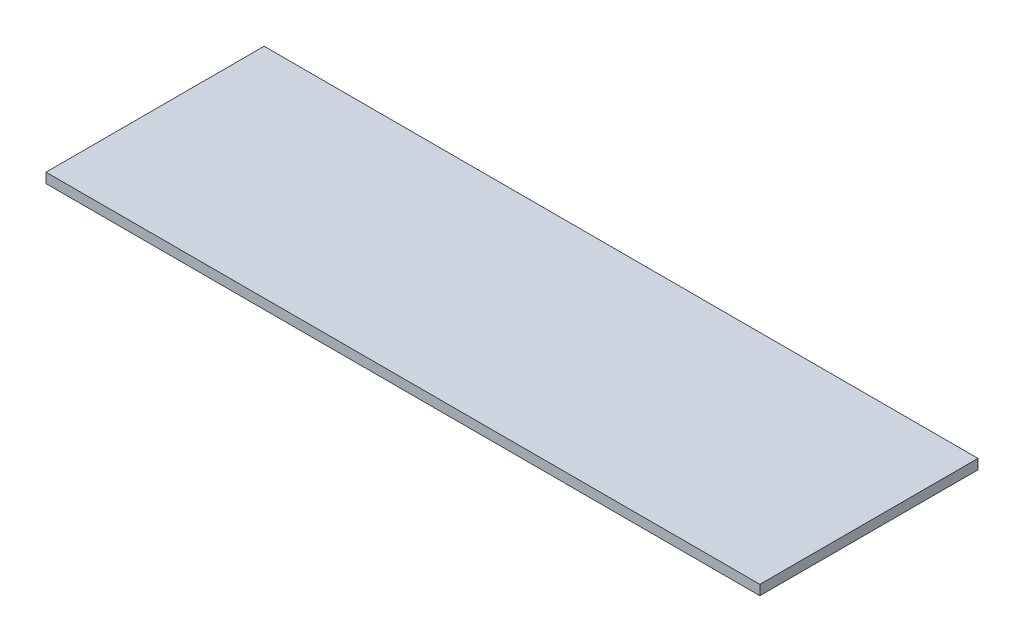
ISO-10303-21;
HEADER;
FILE_DESCRIPTION(('STEP AP214'),'2;1');
FILE_NAME('part.step','',(''),(''),'','','');
FILE_SCHEMA(('AUTOMOTIVE_DESIGN { 1 0 10303 214 1 1 1 1 }'));
ENDSEC;
DATA;
#1=APPLICATION_CONTEXT('core data for automotive mechanical design processes');
#2=APPLICATION_PROTOCOL_DEFINITION('international standard','automotive_design',2000,#1);
#3=PRODUCT_CONTEXT('',#1,'mechanical');
#4=PRODUCT('Part','Part','',(#3));
#5=PRODUCT_RELATED_PRODUCT_CATEGORY('part','',(#4));
#6=PRODUCT_DEFINITION_FORMATION('','',#4);
#7=PRODUCT_DEFINITION_CONTEXT('part definition',#1,'design');
#8=PRODUCT_DEFINITION('design','',#6,#7);
#9=PRODUCT_DEFINITION_SHAPE('','',#8);
#10=(LENGTH_UNIT() NAMED_UNIT(*) SI_UNIT(.MILLI.,.METRE.));
#11=(NAMED_UNIT(*) PLANE_ANGLE_UNIT() SI_UNIT($,.RADIAN.));
#12=(NAMED_UNIT(*) SI_UNIT($,.STERADIAN.) SOLID_ANGLE_UNIT());
#13=UNCERTAINTY_MEASURE_WITH_UNIT(LENGTH_MEASURE(1.E-05),#10,'distance_accuracy_value','');
#14=(GEOMETRIC_REPRESENTATION_CONTEXT(3) GLOBAL_UNCERTAINTY_ASSIGNED_CONTEXT((#13)) GLOBAL_UNIT_ASSIGNED_CONTEXT((#10,
#11,#12)) REPRESENTATION_CONTEXT('',''));
#15=CARTESIAN_POINT('',(0.,0.,0.));
#16=DIRECTION('',(0.,0.,1.));
#17=DIRECTION('',(1.,0.,0.));
#18=AXIS2_PLACEMENT_3D('',#15,#16,#17);
#19=CARTESIAN_POINT('',(114.3,3.175,34.925));
#20=DIRECTION('',(-1.,0.,0.));
#21=DIRECTION('',(0.,0.,1.));
#22=AXIS2_PLACEMENT_3D('',#19,#20,#21);
#23=PLANE('',#22);
#24=DIRECTION('',(0.,0.,-1.));
#25=VECTOR('',#24,1.);
#26=CARTESIAN_POINT('',(114.3,0.,34.925));
#27=LINE('',#26,#25);
#28=CARTESIAN_POINT('',(114.3,0.,34.925));
#29=VERTEX_POINT('',#28);
#30=CARTESIAN_POINT('',(114.3,0.,-34.925));
#31=VERTEX_POINT('',#30);
#32=EDGE_CURVE('E97',#29,#31,#27,.T.);
#33=ORIENTED_EDGE('',*,*,#32,.T.);
#34=DIRECTION('',(0.,-1.,0.));
#35=VECTOR('',#34,1.);
#36=CARTESIAN_POINT('',(114.3,3.175,-34.925));
#37=LINE('',#36,#35);
#38=CARTESIAN_POINT('',(114.3,3.175,-34.925));
#39=VERTEX_POINT('',#38);
#40=EDGE_CURVE('E11',#39,#31,#37,.T.);
#41=ORIENTED_EDGE('',*,*,#40,.F.);
#42=DIRECTION('',(0.,0.,-1.));
#43=VECTOR('',#42,1.);
#44=CARTESIAN_POINT('',(114.3,3.175,34.925));
#45=LINE('',#44,#43);
#46=CARTESIAN_POINT('',(114.3,3.175,34.925));
#47=VERTEX_POINT('',#46);
#48=EDGE_CURVE('E85',#47,#39,#45,.T.);
#49=ORIENTED_EDGE('',*,*,#48,.F.);
#50=DIRECTION('',(0.,-1.,0.));
#51=VECTOR('',#50,1.);
#52=CARTESIAN_POINT('',(114.3,3.175,34.925));
#53=LINE('',#52,#51);
#54=EDGE_CURVE('E93',#47,#29,#53,.T.);
#55=ORIENTED_EDGE('',*,*,#54,.T.);
#56=EDGE_LOOP('',(#33,#41,#49,#55));
#57=FACE_BOUND('',#56,.T.);
#58=ADVANCED_FACE('F34',(#57),#23,.F.);
#59=CARTESIAN_POINT('',(-114.3,3.175,-34.925));
#60=DIRECTION('',(0.,0.,1.));
#61=DIRECTION('',(1.,0.,0.));
#62=AXIS2_PLACEMENT_3D('',#59,#60,#61);
#63=PLANE('',#62);
#64=DIRECTION('',(-1.,0.,0.));
#65=VECTOR('',#64,1.);
#66=CARTESIAN_POINT('',(-114.3,0.,-34.925));
#67=LINE('',#66,#65);
#68=CARTESIAN_POINT('',(-114.3,0.,-34.925));
#69=VERTEX_POINT('',#68);
#70=EDGE_CURVE('E89',#31,#69,#67,.T.);
#71=ORIENTED_EDGE('',*,*,#70,.T.);
#72=DIRECTION('',(0.,-1.,0.));
#73=VECTOR('',#72,1.);
#74=CARTESIAN_POINT('',(-114.3,3.175,-34.925));
#75=LINE('',#74,#73);
#76=CARTESIAN_POINT('',(-114.3,3.175,-34.925));
#77=VERTEX_POINT('',#76);
#78=EDGE_CURVE('E42',#77,#69,#75,.T.);
#79=ORIENTED_EDGE('',*,*,#78,.F.);
#80=DIRECTION('',(-1.,0.,0.));
#81=VECTOR('',#80,1.);
#82=CARTESIAN_POINT('',(-114.3,3.175,-34.925));
#83=LINE('',#82,#81);
#84=EDGE_CURVE('E80',#39,#77,#83,.T.);
#85=ORIENTED_EDGE('',*,*,#84,.F.);
#86=ORIENTED_EDGE('',*,*,#40,.T.);
#87=EDGE_LOOP('',(#71,#79,#85,#86));
#88=FACE_BOUND('',#87,.T.);
#89=ADVANCED_FACE('F88',(#88),#63,.F.);
#90=CARTESIAN_POINT('',(-114.3,3.175,34.925));
#91=DIRECTION('',(1.,0.,0.));
#92=DIRECTION('',(0.,0.,-1.));
#93=AXIS2_PLACEMENT_3D('',#90,#91,#92);
#94=PLANE('',#93);
#95=DIRECTION('',(0.,0.,1.));
#96=VECTOR('',#95,1.);
#97=CARTESIAN_POINT('',(-114.3,0.,34.925));
#98=LINE('',#97,#96);
#99=CARTESIAN_POINT('',(-114.3,0.,34.925));
#100=VERTEX_POINT('',#99);
#101=EDGE_CURVE('E67',#69,#100,#98,.T.);
#102=ORIENTED_EDGE('',*,*,#101,.T.);
#103=DIRECTION('',(0.,-1.,0.));
#104=VECTOR('',#103,1.);
#105=CARTESIAN_POINT('',(-114.3,3.175,34.925));
#106=LINE('',#105,#104);
#107=CARTESIAN_POINT('',(-114.3,3.175,34.925));
#108=VERTEX_POINT('',#107);
#109=EDGE_CURVE('E90',#108,#100,#106,.T.);
#110=ORIENTED_EDGE('',*,*,#109,.F.);
#111=DIRECTION('',(0.,0.,1.));
#112=VECTOR('',#111,1.);
#113=CARTESIAN_POINT('',(-114.3,3.175,34.925));
#114=LINE('',#113,#112);
#115=EDGE_CURVE('E83',#77,#108,#114,.T.);
#116=ORIENTED_EDGE('',*,*,#115,.F.);
#117=ORIENTED_EDGE('',*,*,#78,.T.);
#118=EDGE_LOOP('',(#102,#110,#116,#117));
#119=FACE_BOUND('',#118,.T.);
#120=ADVANCED_FACE('F91',(#119),#94,.F.);
#121=CARTESIAN_POINT('',(-114.3,3.175,34.925));
#122=DIRECTION('',(0.,0.,-1.));
#123=DIRECTION('',(-1.,0.,0.));
#124=AXIS2_PLACEMENT_3D('',#121,#122,#123);
#125=PLANE('',#124);
#126=DIRECTION('',(1.,0.,0.));
#127=VECTOR('',#126,1.);
#128=CARTESIAN_POINT('',(-114.3,0.,34.925));
#129=LINE('',#128,#127);
#130=EDGE_CURVE('E73',#100,#29,#129,.T.);
#131=ORIENTED_EDGE('',*,*,#130,.T.);
#132=ORIENTED_EDGE('',*,*,#54,.F.);
#133=DIRECTION('',(1.,0.,0.));
#134=VECTOR('',#133,1.);
#135=CARTESIAN_POINT('',(-114.3,3.175,34.925));
#136=LINE('',#135,#134);
#137=EDGE_CURVE('E50',#108,#47,#136,.T.);
#138=ORIENTED_EDGE('',*,*,#137,.F.);
#139=ORIENTED_EDGE('',*,*,#109,.T.);
#140=EDGE_LOOP('',(#131,#132,#138,#139));
#141=FACE_BOUND('',#140,.T.);
#142=ADVANCED_FACE('F104',(#141),#125,.F.);
#143=CARTESIAN_POINT('',(0.,3.175,0.));
#144=DIRECTION('',(0.,-1.,0.));
#145=DIRECTION('',(0.,0.,-1.));
#146=AXIS2_PLACEMENT_3D('',#143,#144,#145);
#147=PLANE('',#146);
#148=ORIENTED_EDGE('',*,*,#48,.T.);
#149=ORIENTED_EDGE('',*,*,#84,.T.);
#150=ORIENTED_EDGE('',*,*,#115,.T.);
#151=ORIENTED_EDGE('',*,*,#137,.T.);
#152=EDGE_LOOP('',(#148,#149,#150,#151));
#153=FACE_BOUND('',#152,.T.);
#154=ADVANCED_FACE('F81',(#153),#147,.F.);
#155=CARTESIAN_POINT('',(0.,0.,0.));
#156=DIRECTION('',(0.,-1.,0.));
#157=DIRECTION('',(0.,0.,-1.));
#158=AXIS2_PLACEMENT_3D('',#155,#156,#157);
#159=PLANE('',#158);
#160=ORIENTED_EDGE('',*,*,#32,.F.);
#161=ORIENTED_EDGE('',*,*,#130,.F.);
#162=ORIENTED_EDGE('',*,*,#101,.F.);
#163=ORIENTED_EDGE('',*,*,#70,.F.);
#164=EDGE_LOOP('',(#160,#161,#162,#163));
#165=FACE_BOUND('',#164,.T.);
#166=ADVANCED_FACE('F107',(#165),#159,.T.);
#167=CLOSED_SHELL('',(#58,#89,#120,#142,#154,#166));
#168=MANIFOLD_SOLID_BREP('B2',#167);
#169=ADVANCED_BREP_SHAPE_REPRESENTATION('',(#18,#168),#14);
#170=SHAPE_DEFINITION_REPRESENTATION(#9,#169);
ENDSEC;
END-ISO-10303-21;
